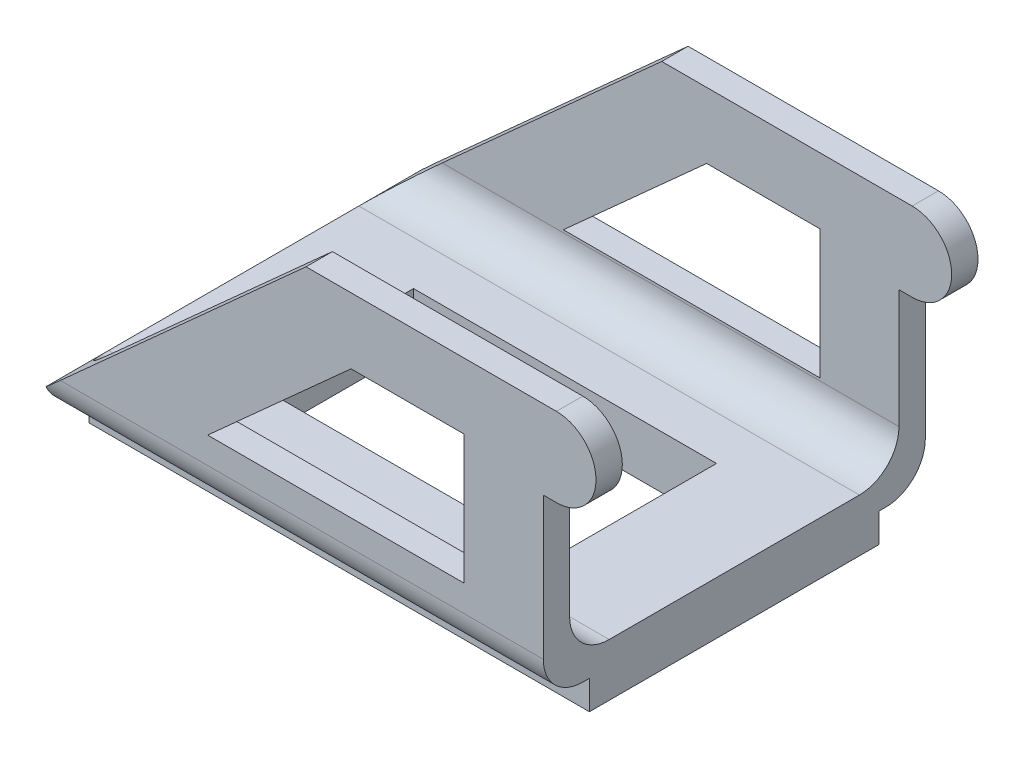
ISO-10303-21;
HEADER;
FILE_DESCRIPTION(('STEP AP214'),'2;1');
FILE_NAME('part.step','',(''),(''),'','','');
FILE_SCHEMA(('AUTOMOTIVE_DESIGN { 1 0 10303 214 1 1 1 1 }'));
ENDSEC;
DATA;
#1=APPLICATION_CONTEXT('core data for automotive mechanical design processes');
#2=APPLICATION_PROTOCOL_DEFINITION('international standard','automotive_design',2000,#1);
#3=PRODUCT_CONTEXT('',#1,'mechanical');
#4=PRODUCT('Part','Part','',(#3));
#5=PRODUCT_RELATED_PRODUCT_CATEGORY('part','',(#4));
#6=PRODUCT_DEFINITION_FORMATION('','',#4);
#7=PRODUCT_DEFINITION_CONTEXT('part definition',#1,'design');
#8=PRODUCT_DEFINITION('design','',#6,#7);
#9=PRODUCT_DEFINITION_SHAPE('','',#8);
#10=(LENGTH_UNIT() NAMED_UNIT(*) SI_UNIT(.MILLI.,.METRE.));
#11=(NAMED_UNIT(*) PLANE_ANGLE_UNIT() SI_UNIT($,.RADIAN.));
#12=(NAMED_UNIT(*) SI_UNIT($,.STERADIAN.) SOLID_ANGLE_UNIT());
#13=UNCERTAINTY_MEASURE_WITH_UNIT(LENGTH_MEASURE(1.E-05),#10,'distance_accuracy_value','');
#14=(GEOMETRIC_REPRESENTATION_CONTEXT(3) GLOBAL_UNCERTAINTY_ASSIGNED_CONTEXT((#13)) GLOBAL_UNIT_ASSIGNED_CONTEXT((#10,
#11,#12)) REPRESENTATION_CONTEXT('',''));
#15=CARTESIAN_POINT('',(0.,0.,0.));
#16=DIRECTION('',(0.,0.,1.));
#17=DIRECTION('',(1.,0.,0.));
#18=AXIS2_PLACEMENT_3D('',#15,#16,#17);
#19=CARTESIAN_POINT('',(23.,2.2,-14.5));
#20=DIRECTION('',(0.,0.,-1.));
#21=DIRECTION('',(-1.,0.,0.));
#22=AXIS2_PLACEMENT_3D('',#19,#20,#21);
#23=PLANE('',#22);
#24=CARTESIAN_POINT('',(20.,19.,-14.5));
#25=DIRECTION('',(0.,0.,-1.));
#26=DIRECTION('',(-1.,0.,0.));
#27=AXIS2_PLACEMENT_3D('',#24,#25,#26);
#28=CIRCLE('',#27,1.);
#29=CARTESIAN_POINT('',(19.,19.,-14.5));
#30=VERTEX_POINT('',#29);
#31=EDGE_CURVE('E323',#30,#30,#28,.T.);
#32=ORIENTED_EDGE('',*,*,#31,.F.);
#33=EDGE_LOOP('',(#32));
#34=FACE_BOUND('',#33,.T.);
#35=DIRECTION('',(0.743144825477394,0.669130606358859,0.));
#36=VECTOR('',#35,1.);
#37=CARTESIAN_POINT('',(4.4048219919671,17.,-14.5));
#38=LINE('',#37,#36);
#39=CARTESIAN_POINT('',(-6.47918065335896,7.2,-14.5));
#40=VERTEX_POINT('',#39);
#41=CARTESIAN_POINT('',(4.4048219919671,17.,-14.5));
#42=VERTEX_POINT('',#41);
#43=EDGE_CURVE('E85',#40,#42,#38,.T.);
#44=ORIENTED_EDGE('',*,*,#43,.F.);
#45=DIRECTION('',(-1.,0.,0.));
#46=VECTOR('',#45,1.);
#47=CARTESIAN_POINT('',(-6.47918065335896,7.2,-14.5));
#48=LINE('',#47,#46);
#49=CARTESIAN_POINT('',(13.,7.2,-14.5));
#50=VERTEX_POINT('',#49);
#51=EDGE_CURVE('E316',#50,#40,#48,.T.);
#52=ORIENTED_EDGE('',*,*,#51,.F.);
#53=DIRECTION('',(0.,-1.,0.));
#54=VECTOR('',#53,1.);
#55=CARTESIAN_POINT('',(13.,7.2,-14.5));
#56=LINE('',#55,#54);
#57=CARTESIAN_POINT('',(13.,17.,-14.5));
#58=VERTEX_POINT('',#57);
#59=EDGE_CURVE('E320',#58,#50,#56,.T.);
#60=ORIENTED_EDGE('',*,*,#59,.F.);
#61=DIRECTION('',(1.,0.,0.));
#62=VECTOR('',#61,1.);
#63=CARTESIAN_POINT('',(13.,17.,-14.5));
#64=LINE('',#63,#62);
#65=EDGE_CURVE('E331',#42,#58,#64,.T.);
#66=ORIENTED_EDGE('',*,*,#65,.F.);
#67=EDGE_LOOP('',(#44,#52,#60,#66));
#68=FACE_BOUND('',#67,.T.);
#69=DIRECTION('',(-1.,0.,0.));
#70=VECTOR('',#69,1.);
#71=CARTESIAN_POINT('',(23.,22.,-14.5));
#72=LINE('',#71,#70);
#73=CARTESIAN_POINT('',(20.,22.,-14.5));
#74=VERTEX_POINT('',#73);
#75=CARTESIAN_POINT('',(0.991025266925419,22.,-14.5));
#76=VERTEX_POINT('',#75);
#77=EDGE_CURVE('E506',#74,#76,#72,.T.);
#78=ORIENTED_EDGE('',*,*,#77,.F.);
#79=CARTESIAN_POINT('',(20.,19.,-14.5));
#80=DIRECTION('',(0.,0.,-1.));
#81=DIRECTION('',(-1.,0.,0.));
#82=AXIS2_PLACEMENT_3D('',#79,#80,#81);
#83=CIRCLE('',#82,3.);
#84=CARTESIAN_POINT('',(20.,16.,-14.5));
#85=VERTEX_POINT('',#84);
#86=EDGE_CURVE('E420',#74,#85,#83,.T.);
#87=ORIENTED_EDGE('',*,*,#86,.T.);
#88=DIRECTION('',(-1.,0.,0.));
#89=VECTOR('',#88,1.);
#90=CARTESIAN_POINT('',(0.,16.,-14.5));
#91=LINE('',#90,#89);
#92=CARTESIAN_POINT('',(19.,16.,-14.5));
#93=VERTEX_POINT('',#92);
#94=EDGE_CURVE('E430',#85,#93,#91,.T.);
#95=ORIENTED_EDGE('',*,*,#94,.T.);
#96=DIRECTION('',(0.,-1.,0.));
#97=VECTOR('',#96,1.);
#98=CARTESIAN_POINT('',(19.,0.,-14.5));
#99=LINE('',#98,#97);
#100=CARTESIAN_POINT('',(19.,5.2,-14.5));
#101=VERTEX_POINT('',#100);
#102=EDGE_CURVE('E414',#93,#101,#99,.T.);
#103=ORIENTED_EDGE('',*,*,#102,.T.);
#104=DIRECTION('',(-1.,0.,0.));
#105=VECTOR('',#104,1.);
#106=CARTESIAN_POINT('',(23.,5.2,-14.5));
#107=LINE('',#106,#105);
#108=CARTESIAN_POINT('',(-17.667264982205,5.2,-14.5));
#109=VERTEX_POINT('',#108);
#110=EDGE_CURVE('E617',#101,#109,#107,.T.);
#111=ORIENTED_EDGE('',*,*,#110,.T.);
#112=DIRECTION('',(0.743144825477393,0.669130606358859,0.));
#113=VECTOR('',#112,1.);
#114=CARTESIAN_POINT('',(-10.4960233896939,11.6570149325339,-14.5));
#115=LINE('',#114,#113);
#116=EDGE_CURVE('E371',#109,#76,#115,.T.);
#117=ORIENTED_EDGE('',*,*,#116,.T.);
#118=EDGE_LOOP('',(#78,#87,#95,#103,#111,#117));
#119=FACE_BOUND('',#118,.T.);
#120=ADVANCED_FACE('F69',(#34,#68,#119),#23,.T.);
#121=CARTESIAN_POINT('',(23.,22.,-12.5));
#122=DIRECTION('',(0.,0.,1.));
#123=DIRECTION('',(0.,-1.,0.));
#124=AXIS2_PLACEMENT_3D('',#121,#122,#123);
#125=PLANE('',#124);
#126=DIRECTION('',(-0.743144825477393,-0.669130606358859,0.));
#127=VECTOR('',#126,1.);
#128=CARTESIAN_POINT('',(17.1605784250883,28.4853346804605,-12.5));
#129=LINE('',#128,#127);
#130=CARTESIAN_POINT('',(4.4048219919671,17.,-12.5));
#131=VERTEX_POINT('',#130);
#132=CARTESIAN_POINT('',(-6.47918065335896,7.2,-12.5));
#133=VERTEX_POINT('',#132);
#134=EDGE_CURVE('E368',#131,#133,#129,.T.);
#135=ORIENTED_EDGE('',*,*,#134,.F.);
#136=DIRECTION('',(-1.,0.,0.));
#137=VECTOR('',#136,1.);
#138=CARTESIAN_POINT('',(23.,17.,-12.5));
#139=LINE('',#138,#137);
#140=CARTESIAN_POINT('',(13.,17.,-12.5));
#141=VERTEX_POINT('',#140);
#142=EDGE_CURVE('E351',#141,#131,#139,.T.);
#143=ORIENTED_EDGE('',*,*,#142,.F.);
#144=DIRECTION('',(0.,1.,0.));
#145=VECTOR('',#144,1.);
#146=CARTESIAN_POINT('',(13.,22.,-12.5));
#147=LINE('',#146,#145);
#148=CARTESIAN_POINT('',(13.,7.2,-12.5));
#149=VERTEX_POINT('',#148);
#150=EDGE_CURVE('E357',#149,#141,#147,.T.);
#151=ORIENTED_EDGE('',*,*,#150,.F.);
#152=DIRECTION('',(1.,0.,0.));
#153=VECTOR('',#152,1.);
#154=CARTESIAN_POINT('',(23.,7.2,-12.5));
#155=LINE('',#154,#153);
#156=EDGE_CURVE('E363',#133,#149,#155,.T.);
#157=ORIENTED_EDGE('',*,*,#156,.F.);
#158=EDGE_LOOP('',(#135,#143,#151,#157));
#159=FACE_BOUND('',#158,.T.);
#160=CARTESIAN_POINT('',(20.,19.,-12.5));
#161=DIRECTION('',(0.,0.,1.));
#162=DIRECTION('',(0.,-1.,0.));
#163=AXIS2_PLACEMENT_3D('',#160,#161,#162);
#164=CIRCLE('',#163,3.);
#165=CARTESIAN_POINT('',(20.,16.,-12.5));
#166=VERTEX_POINT('',#165);
#167=CARTESIAN_POINT('',(20.,22.,-12.5));
#168=VERTEX_POINT('',#167);
#169=EDGE_CURVE('E469',#166,#168,#164,.T.);
#170=ORIENTED_EDGE('',*,*,#169,.T.);
#171=DIRECTION('',(-1.,0.,0.));
#172=VECTOR('',#171,1.);
#173=CARTESIAN_POINT('',(23.,22.,-12.5));
#174=LINE('',#173,#172);
#175=CARTESIAN_POINT('',(0.991025266925429,22.,-12.5));
#176=VERTEX_POINT('',#175);
#177=EDGE_CURVE('E501',#168,#176,#174,.T.);
#178=ORIENTED_EDGE('',*,*,#177,.T.);
#179=DIRECTION('',(-0.743144825477393,-0.669130606358859,0.));
#180=VECTOR('',#179,1.);
#181=CARTESIAN_POINT('',(13.1457947869351,32.9442036333249,-12.5));
#182=LINE('',#181,#180);
#183=CARTESIAN_POINT('',(-15.6681624555124,7.,-12.5));
#184=VERTEX_POINT('',#183);
#185=EDGE_CURVE('E403',#176,#184,#182,.T.);
#186=ORIENTED_EDGE('',*,*,#185,.T.);
#187=DIRECTION('',(-1.,0.,0.));
#188=VECTOR('',#187,1.);
#189=CARTESIAN_POINT('',(23.,7.,-12.5));
#190=LINE('',#189,#188);
#191=CARTESIAN_POINT('',(19.,7.,-12.5));
#192=VERTEX_POINT('',#191);
#193=EDGE_CURVE('E601',#184,#192,#190,.F.);
#194=ORIENTED_EDGE('',*,*,#193,.T.);
#195=DIRECTION('',(0.,1.,0.));
#196=VECTOR('',#195,1.);
#197=CARTESIAN_POINT('',(19.,22.,-12.5));
#198=LINE('',#197,#196);
#199=CARTESIAN_POINT('',(19.,16.,-12.5));
#200=VERTEX_POINT('',#199);
#201=EDGE_CURVE('E457',#192,#200,#198,.T.);
#202=ORIENTED_EDGE('',*,*,#201,.T.);
#203=DIRECTION('',(1.,0.,0.));
#204=VECTOR('',#203,1.);
#205=CARTESIAN_POINT('',(23.,16.,-12.5));
#206=LINE('',#205,#204);
#207=EDGE_CURVE('E476',#200,#166,#206,.T.);
#208=ORIENTED_EDGE('',*,*,#207,.T.);
#209=EDGE_LOOP('',(#170,#178,#186,#194,#202,#208));
#210=FACE_BOUND('',#209,.T.);
#211=ADVANCED_FACE('F649',(#159,#210),#125,.T.);
#212=CARTESIAN_POINT('',(23.,22.,12.5));
#213=DIRECTION('',(0.,0.,-1.));
#214=DIRECTION('',(0.,1.,0.));
#215=AXIS2_PLACEMENT_3D('',#212,#213,#214);
#216=PLANE('',#215);
#217=DIRECTION('',(0.743144825477393,0.669130606358859,0.));
#218=VECTOR('',#217,1.);
#219=CARTESIAN_POINT('',(17.1605784250883,28.4853346804605,12.5));
#220=LINE('',#219,#218);
#221=CARTESIAN_POINT('',(-6.47918065335896,7.2,12.5));
#222=VERTEX_POINT('',#221);
#223=CARTESIAN_POINT('',(4.4048219919671,17.,12.5));
#224=VERTEX_POINT('',#223);
#225=EDGE_CURVE('E294',#222,#224,#220,.T.);
#226=ORIENTED_EDGE('',*,*,#225,.F.);
#227=DIRECTION('',(-1.,0.,0.));
#228=VECTOR('',#227,1.);
#229=CARTESIAN_POINT('',(23.,7.2,12.5));
#230=LINE('',#229,#228);
#231=CARTESIAN_POINT('',(13.,7.2,12.5));
#232=VERTEX_POINT('',#231);
#233=EDGE_CURVE('E360',#232,#222,#230,.T.);
#234=ORIENTED_EDGE('',*,*,#233,.F.);
#235=DIRECTION('',(0.,-1.,0.));
#236=VECTOR('',#235,1.);
#237=CARTESIAN_POINT('',(13.,22.,12.5));
#238=LINE('',#237,#236);
#239=CARTESIAN_POINT('',(13.,17.,12.5));
#240=VERTEX_POINT('',#239);
#241=EDGE_CURVE('E354',#240,#232,#238,.T.);
#242=ORIENTED_EDGE('',*,*,#241,.F.);
#243=DIRECTION('',(1.,0.,0.));
#244=VECTOR('',#243,1.);
#245=CARTESIAN_POINT('',(23.,17.,12.5));
#246=LINE('',#245,#244);
#247=EDGE_CURVE('E340',#224,#240,#246,.T.);
#248=ORIENTED_EDGE('',*,*,#247,.F.);
#249=EDGE_LOOP('',(#226,#234,#242,#248));
#250=FACE_BOUND('',#249,.T.);
#251=DIRECTION('',(-1.,0.,0.));
#252=VECTOR('',#251,1.);
#253=CARTESIAN_POINT('',(23.,22.,12.5));
#254=LINE('',#253,#252);
#255=CARTESIAN_POINT('',(20.,22.,12.5));
#256=VERTEX_POINT('',#255);
#257=CARTESIAN_POINT('',(0.991025266925419,22.,12.5));
#258=VERTEX_POINT('',#257);
#259=EDGE_CURVE('E480',#256,#258,#254,.T.);
#260=ORIENTED_EDGE('',*,*,#259,.F.);
#261=CARTESIAN_POINT('',(20.,19.,12.5));
#262=DIRECTION('',(0.,0.,-1.));
#263=DIRECTION('',(0.,1.,0.));
#264=AXIS2_PLACEMENT_3D('',#261,#262,#263);
#265=CIRCLE('',#264,3.);
#266=CARTESIAN_POINT('',(20.,16.,12.5));
#267=VERTEX_POINT('',#266);
#268=EDGE_CURVE('E465',#256,#267,#265,.T.);
#269=ORIENTED_EDGE('',*,*,#268,.T.);
#270=DIRECTION('',(-1.,0.,0.));
#271=VECTOR('',#270,1.);
#272=CARTESIAN_POINT('',(23.,16.,12.5));
#273=LINE('',#272,#271);
#274=CARTESIAN_POINT('',(19.,16.,12.5));
#275=VERTEX_POINT('',#274);
#276=EDGE_CURVE('E472',#267,#275,#273,.T.);
#277=ORIENTED_EDGE('',*,*,#276,.T.);
#278=DIRECTION('',(0.,-1.,0.));
#279=VECTOR('',#278,1.);
#280=CARTESIAN_POINT('',(19.,22.,12.5));
#281=LINE('',#280,#279);
#282=CARTESIAN_POINT('',(19.,7.,12.5));
#283=VERTEX_POINT('',#282);
#284=EDGE_CURVE('E461',#275,#283,#281,.T.);
#285=ORIENTED_EDGE('',*,*,#284,.T.);
#286=DIRECTION('',(-1.,0.,0.));
#287=VECTOR('',#286,1.);
#288=CARTESIAN_POINT('',(23.,7.,12.5));
#289=LINE('',#288,#287);
#290=CARTESIAN_POINT('',(-15.6681624555124,7.,12.5));
#291=VERTEX_POINT('',#290);
#292=EDGE_CURVE('E485',#283,#291,#289,.T.);
#293=ORIENTED_EDGE('',*,*,#292,.T.);
#294=DIRECTION('',(0.743144825477393,0.669130606358859,0.));
#295=VECTOR('',#294,1.);
#296=CARTESIAN_POINT('',(13.1457947869351,32.9442036333249,12.5));
#297=LINE('',#296,#295);
#298=EDGE_CURVE('E410',#291,#258,#297,.T.);
#299=ORIENTED_EDGE('',*,*,#298,.T.);
#300=EDGE_LOOP('',(#260,#269,#277,#285,#293,#299));
#301=FACE_BOUND('',#300,.T.);
#302=ADVANCED_FACE('F657',(#250,#301),#216,.T.);
#303=CARTESIAN_POINT('',(23.,2.2,14.5));
#304=DIRECTION('',(0.,0.,1.));
#305=DIRECTION('',(1.,0.,0.));
#306=AXIS2_PLACEMENT_3D('',#303,#304,#305);
#307=PLANE('',#306);
#308=DIRECTION('',(0.743144825477394,0.669130606358859,0.));
#309=VECTOR('',#308,1.);
#310=CARTESIAN_POINT('',(4.4048219919671,17.,14.5));
#311=LINE('',#310,#309);
#312=CARTESIAN_POINT('',(-6.47918065335896,7.2,14.5));
#313=VERTEX_POINT('',#312);
#314=CARTESIAN_POINT('',(4.4048219919671,17.,14.5));
#315=VERTEX_POINT('',#314);
#316=EDGE_CURVE('E291',#313,#315,#311,.T.);
#317=ORIENTED_EDGE('',*,*,#316,.T.);
#318=DIRECTION('',(1.,0.,0.));
#319=VECTOR('',#318,1.);
#320=CARTESIAN_POINT('',(13.,17.,14.5));
#321=LINE('',#320,#319);
#322=CARTESIAN_POINT('',(13.,17.,14.5));
#323=VERTEX_POINT('',#322);
#324=EDGE_CURVE('E302',#315,#323,#321,.T.);
#325=ORIENTED_EDGE('',*,*,#324,.T.);
#326=DIRECTION('',(0.,-1.,0.));
#327=VECTOR('',#326,1.);
#328=CARTESIAN_POINT('',(13.,7.2,14.5));
#329=LINE('',#328,#327);
#330=CARTESIAN_POINT('',(13.,7.2,14.5));
#331=VERTEX_POINT('',#330);
#332=EDGE_CURVE('E309',#323,#331,#329,.T.);
#333=ORIENTED_EDGE('',*,*,#332,.T.);
#334=DIRECTION('',(-1.,0.,0.));
#335=VECTOR('',#334,1.);
#336=CARTESIAN_POINT('',(-6.47918065335896,7.2,14.5));
#337=LINE('',#336,#335);
#338=EDGE_CURVE('E314',#331,#313,#337,.T.);
#339=ORIENTED_EDGE('',*,*,#338,.T.);
#340=EDGE_LOOP('',(#317,#325,#333,#339));
#341=FACE_BOUND('',#340,.T.);
#342=CARTESIAN_POINT('',(20.,19.,14.5));
#343=DIRECTION('',(0.,0.,-1.));
#344=DIRECTION('',(-1.,0.,0.));
#345=AXIS2_PLACEMENT_3D('',#342,#343,#344);
#346=CIRCLE('',#345,3.);
#347=CARTESIAN_POINT('',(20.,22.,14.5));
#348=VERTEX_POINT('',#347);
#349=CARTESIAN_POINT('',(20.,16.,14.5));
#350=VERTEX_POINT('',#349);
#351=EDGE_CURVE('E423',#348,#350,#346,.T.);
#352=ORIENTED_EDGE('',*,*,#351,.F.);
#353=DIRECTION('',(-1.,0.,0.));
#354=VECTOR('',#353,1.);
#355=CARTESIAN_POINT('',(23.,22.,14.5));
#356=LINE('',#355,#354);
#357=CARTESIAN_POINT('',(0.991025266925426,22.,14.5));
#358=VERTEX_POINT('',#357);
#359=EDGE_CURVE('E487',#348,#358,#356,.T.);
#360=ORIENTED_EDGE('',*,*,#359,.T.);
#361=DIRECTION('',(0.743144825477393,0.669130606358859,0.));
#362=VECTOR('',#361,1.);
#363=CARTESIAN_POINT('',(-10.4960233896939,11.6570149325339,14.5));
#364=LINE('',#363,#362);
#365=CARTESIAN_POINT('',(-17.667264982205,5.2,14.5));
#366=VERTEX_POINT('',#365);
#367=EDGE_CURVE('E378',#366,#358,#364,.T.);
#368=ORIENTED_EDGE('',*,*,#367,.F.);
#369=DIRECTION('',(-1.,0.,0.));
#370=VECTOR('',#369,1.);
#371=CARTESIAN_POINT('',(23.,5.2,14.5));
#372=LINE('',#371,#370);
#373=CARTESIAN_POINT('',(19.,5.2,14.5));
#374=VERTEX_POINT('',#373);
#375=EDGE_CURVE('E614',#366,#374,#372,.F.);
#376=ORIENTED_EDGE('',*,*,#375,.T.);
#377=DIRECTION('',(0.,-1.,0.));
#378=VECTOR('',#377,1.);
#379=CARTESIAN_POINT('',(19.,0.,14.5));
#380=LINE('',#379,#378);
#381=CARTESIAN_POINT('',(19.,16.,14.5));
#382=VERTEX_POINT('',#381);
#383=EDGE_CURVE('E415',#382,#374,#380,.T.);
#384=ORIENTED_EDGE('',*,*,#383,.F.);
#385=DIRECTION('',(-1.,0.,0.));
#386=VECTOR('',#385,1.);
#387=CARTESIAN_POINT('',(0.,16.,14.5));
#388=LINE('',#387,#386);
#389=EDGE_CURVE('E419',#350,#382,#388,.T.);
#390=ORIENTED_EDGE('',*,*,#389,.F.);
#391=EDGE_LOOP('',(#352,#360,#368,#376,#384,#390));
#392=FACE_BOUND('',#391,.T.);
#393=ADVANCED_FACE('F311',(#341,#392),#307,.T.);
#394=CARTESIAN_POINT('',(23.,7.,9.5));
#395=DIRECTION('',(-1.,0.,0.));
#396=DIRECTION('',(0.,0.,1.));
#397=AXIS2_PLACEMENT_3D('',#394,#395,#396);
#398=CYLINDRICAL_SURFACE('',#397,3.);
#399=CARTESIAN_POINT('',(-15.6681624555124,7.,9.5));
#400=DIRECTION('',(-0.669130606358859,0.743144825477393,0.));
#401=DIRECTION('',(-0.743144825477393,-0.669130606358859,0.));
#402=AXIS2_PLACEMENT_3D('',#399,#400,#401);
#403=ELLIPSE('',#402,4.48342964959382,3.);
#404=CARTESIAN_POINT('',(-19.,4.,9.5));
#405=VERTEX_POINT('',#404);
#406=EDGE_CURVE('E407',#291,#405,#403,.F.);
#407=ORIENTED_EDGE('',*,*,#406,.F.);
#408=ORIENTED_EDGE('',*,*,#292,.F.);
#409=CARTESIAN_POINT('',(19.,7.,9.5));
#410=DIRECTION('',(-1.,0.,0.));
#411=DIRECTION('',(0.,0.,1.));
#412=AXIS2_PLACEMENT_3D('',#409,#410,#411);
#413=CIRCLE('',#412,3.);
#414=CARTESIAN_POINT('',(19.,4.,9.5));
#415=VERTEX_POINT('',#414);
#416=EDGE_CURVE('E625',#415,#283,#413,.T.);
#417=ORIENTED_EDGE('',*,*,#416,.F.);
#418=DIRECTION('',(-1.,0.,0.));
#419=VECTOR('',#418,1.);
#420=CARTESIAN_POINT('',(0.,4.,9.5));
#421=LINE('',#420,#419);
#422=EDGE_CURVE('E598',#405,#415,#421,.F.);
#423=ORIENTED_EDGE('',*,*,#422,.F.);
#424=EDGE_LOOP('',(#407,#408,#417,#423));
#425=FACE_BOUND('',#424,.T.);
#426=ADVANCED_FACE('F714',(#425),#398,.F.);
#427=CARTESIAN_POINT('',(0.,7.,-9.5));
#428=DIRECTION('',(-1.,0.,0.));
#429=DIRECTION('',(0.,0.,1.));
#430=AXIS2_PLACEMENT_3D('',#427,#428,#429);
#431=CYLINDRICAL_SURFACE('',#430,3.);
#432=CARTESIAN_POINT('',(-15.6681624555124,7.,-9.5));
#433=DIRECTION('',(-0.669130606358859,0.743144825477393,0.));
#434=DIRECTION('',(-0.743144825477393,-0.669130606358859,0.));
#435=AXIS2_PLACEMENT_3D('',#432,#433,#434);
#436=ELLIPSE('',#435,4.48342964959382,3.);
#437=CARTESIAN_POINT('',(-19.,4.,-9.5));
#438=VERTEX_POINT('',#437);
#439=EDGE_CURVE('E400',#438,#184,#436,.F.);
#440=ORIENTED_EDGE('',*,*,#439,.F.);
#441=DIRECTION('',(-1.,0.,0.));
#442=VECTOR('',#441,1.);
#443=CARTESIAN_POINT('',(0.,4.,-9.5));
#444=LINE('',#443,#442);
#445=CARTESIAN_POINT('',(19.,4.,-9.5));
#446=VERTEX_POINT('',#445);
#447=EDGE_CURVE('E594',#446,#438,#444,.T.);
#448=ORIENTED_EDGE('',*,*,#447,.F.);
#449=CARTESIAN_POINT('',(19.,7.,-9.5));
#450=DIRECTION('',(-1.,0.,0.));
#451=DIRECTION('',(0.,0.,1.));
#452=AXIS2_PLACEMENT_3D('',#449,#450,#451);
#453=CIRCLE('',#452,3.);
#454=EDGE_CURVE('E628',#192,#446,#453,.T.);
#455=ORIENTED_EDGE('',*,*,#454,.F.);
#456=ORIENTED_EDGE('',*,*,#193,.F.);
#457=EDGE_LOOP('',(#440,#448,#455,#456));
#458=FACE_BOUND('',#457,.T.);
#459=ADVANCED_FACE('F717',(#458),#431,.F.);
#460=CARTESIAN_POINT('',(23.,5.2,11.5));
#461=DIRECTION('',(-1.,0.,0.));
#462=DIRECTION('',(0.,0.,1.));
#463=AXIS2_PLACEMENT_3D('',#460,#461,#462);
#464=CYLINDRICAL_SURFACE('',#463,3.);
#465=ORIENTED_EDGE('',*,*,#375,.F.);
#466=CARTESIAN_POINT('',(-17.667264982205,5.2,11.5));
#467=DIRECTION('',(-0.669130606358859,0.743144825477393,0.));
#468=DIRECTION('',(-0.743144825477393,-0.669130606358859,0.));
#469=AXIS2_PLACEMENT_3D('',#466,#467,#468);
#470=ELLIPSE('',#469,4.48342964959382,3.);
#471=CARTESIAN_POINT('',(-19.,4.,14.2495454169735));
#472=VERTEX_POINT('',#471);
#473=EDGE_CURVE('E396',#366,#472,#470,.F.);
#474=ORIENTED_EDGE('',*,*,#473,.T.);
#475=CARTESIAN_POINT('',(-19.,5.2,11.5));
#476=DIRECTION('',(1.,0.,0.));
#477=DIRECTION('',(0.,0.,-1.));
#478=AXIS2_PLACEMENT_3D('',#475,#476,#477);
#479=CIRCLE('',#478,3.);
#480=CARTESIAN_POINT('',(-19.,2.2,11.5));
#481=VERTEX_POINT('',#480);
#482=EDGE_CURVE('E610',#481,#472,#479,.F.);
#483=ORIENTED_EDGE('',*,*,#482,.F.);
#484=DIRECTION('',(-1.,0.,0.));
#485=VECTOR('',#484,1.);
#486=CARTESIAN_POINT('',(23.,2.2,11.5));
#487=LINE('',#486,#485);
#488=CARTESIAN_POINT('',(19.,2.2,11.5));
#489=VERTEX_POINT('',#488);
#490=EDGE_CURVE('E604',#489,#481,#487,.T.);
#491=ORIENTED_EDGE('',*,*,#490,.F.);
#492=CARTESIAN_POINT('',(19.,5.2,11.5));
#493=DIRECTION('',(1.,0.,0.));
#494=DIRECTION('',(0.,0.,-1.));
#495=AXIS2_PLACEMENT_3D('',#492,#493,#494);
#496=CIRCLE('',#495,3.);
#497=EDGE_CURVE('E449',#489,#374,#496,.F.);
#498=ORIENTED_EDGE('',*,*,#497,.T.);
#499=EDGE_LOOP('',(#465,#474,#483,#491,#498));
#500=FACE_BOUND('',#499,.T.);
#501=ADVANCED_FACE('F721',(#500),#464,.T.);
#502=CARTESIAN_POINT('',(23.,5.2,-11.5));
#503=DIRECTION('',(-1.,0.,0.));
#504=DIRECTION('',(0.,0.,1.));
#505=AXIS2_PLACEMENT_3D('',#502,#503,#504);
#506=CYLINDRICAL_SURFACE('',#505,3.);
#507=CARTESIAN_POINT('',(-19.,5.2,-11.5));
#508=DIRECTION('',(1.,0.,0.));
#509=DIRECTION('',(0.,0.,-1.));
#510=AXIS2_PLACEMENT_3D('',#507,#508,#509);
#511=CIRCLE('',#510,3.);
#512=CARTESIAN_POINT('',(-19.,4.,-14.2495454169735));
#513=VERTEX_POINT('',#512);
#514=CARTESIAN_POINT('',(-19.,2.2,-11.5));
#515=VERTEX_POINT('',#514);
#516=EDGE_CURVE('E607',#513,#515,#511,.F.);
#517=ORIENTED_EDGE('',*,*,#516,.F.);
#518=CARTESIAN_POINT('',(-17.667264982205,5.2,-11.5));
#519=DIRECTION('',(-0.669130606358859,0.743144825477393,0.));
#520=DIRECTION('',(-0.743144825477393,-0.669130606358859,0.));
#521=AXIS2_PLACEMENT_3D('',#518,#519,#520);
#522=ELLIPSE('',#521,4.48342964959382,3.);
#523=EDGE_CURVE('E376',#513,#109,#522,.F.);
#524=ORIENTED_EDGE('',*,*,#523,.T.);
#525=ORIENTED_EDGE('',*,*,#110,.F.);
#526=CARTESIAN_POINT('',(19.,5.2,-11.5));
#527=DIRECTION('',(1.,0.,0.));
#528=DIRECTION('',(0.,0.,-1.));
#529=AXIS2_PLACEMENT_3D('',#526,#527,#528);
#530=CIRCLE('',#529,3.);
#531=CARTESIAN_POINT('',(19.,2.2,-11.5));
#532=VERTEX_POINT('',#531);
#533=EDGE_CURVE('E631',#101,#532,#530,.F.);
#534=ORIENTED_EDGE('',*,*,#533,.T.);
#535=DIRECTION('',(-1.,0.,0.));
#536=VECTOR('',#535,1.);
#537=CARTESIAN_POINT('',(23.,2.2,-11.5));
#538=LINE('',#537,#536);
#539=EDGE_CURVE('E621',#515,#532,#538,.F.);
#540=ORIENTED_EDGE('',*,*,#539,.F.);
#541=EDGE_LOOP('',(#517,#524,#525,#534,#540));
#542=FACE_BOUND('',#541,.T.);
#543=ADVANCED_FACE('F705',(#542),#506,.T.);
#544=CARTESIAN_POINT('',(-19.,4.,11.));
#545=DIRECTION('',(1.,0.,0.));
#546=DIRECTION('',(0.,0.,-1.));
#547=AXIS2_PLACEMENT_3D('',#544,#545,#546);
#548=PLANE('',#547);
#549=DIRECTION('',(0.,0.,-1.));
#550=VECTOR('',#549,1.);
#551=CARTESIAN_POINT('',(-19.,4.,14.5));
#552=LINE('',#551,#550);
#553=EDGE_CURVE('E381',#438,#513,#552,.T.);
#554=ORIENTED_EDGE('',*,*,#553,.T.);
#555=ORIENTED_EDGE('',*,*,#516,.T.);
#556=DIRECTION('',(0.,0.,1.));
#557=VECTOR('',#556,1.);
#558=CARTESIAN_POINT('',(-19.,2.2,-11.));
#559=LINE('',#558,#557);
#560=CARTESIAN_POINT('',(-19.,2.2,-11.));
#561=VERTEX_POINT('',#560);
#562=EDGE_CURVE('E498',#515,#561,#559,.T.);
#563=ORIENTED_EDGE('',*,*,#562,.T.);
#564=DIRECTION('',(0.,-1.,0.));
#565=VECTOR('',#564,1.);
#566=CARTESIAN_POINT('',(-19.,4.,-11.));
#567=LINE('',#566,#565);
#568=CARTESIAN_POINT('',(-19.,0.,-11.));
#569=VERTEX_POINT('',#568);
#570=EDGE_CURVE('E586',#561,#569,#567,.T.);
#571=ORIENTED_EDGE('',*,*,#570,.T.);
#572=DIRECTION('',(0.,0.,1.));
#573=VECTOR('',#572,1.);
#574=CARTESIAN_POINT('',(-19.,0.,11.));
#575=LINE('',#574,#573);
#576=CARTESIAN_POINT('',(-19.,0.,11.));
#577=VERTEX_POINT('',#576);
#578=EDGE_CURVE('E574',#569,#577,#575,.T.);
#579=ORIENTED_EDGE('',*,*,#578,.T.);
#580=DIRECTION('',(0.,-1.,0.));
#581=VECTOR('',#580,1.);
#582=CARTESIAN_POINT('',(-19.,4.,11.));
#583=LINE('',#582,#581);
#584=CARTESIAN_POINT('',(-19.,2.2,11.));
#585=VERTEX_POINT('',#584);
#586=EDGE_CURVE('E583',#585,#577,#583,.T.);
#587=ORIENTED_EDGE('',*,*,#586,.F.);
#588=DIRECTION('',(0.,0.,1.));
#589=VECTOR('',#588,1.);
#590=CARTESIAN_POINT('',(-19.,2.2,11.));
#591=LINE('',#590,#589);
#592=EDGE_CURVE('E491',#585,#481,#591,.T.);
#593=ORIENTED_EDGE('',*,*,#592,.T.);
#594=ORIENTED_EDGE('',*,*,#482,.T.);
#595=EDGE_CURVE('E392',#472,#405,#552,.T.);
#596=ORIENTED_EDGE('',*,*,#595,.T.);
#597=DIRECTION('',(0.,0.,1.));
#598=VECTOR('',#597,1.);
#599=CARTESIAN_POINT('',(-19.,4.,11.));
#600=LINE('',#599,#598);
#601=EDGE_CURVE('E561',#438,#405,#600,.T.);
#602=ORIENTED_EDGE('',*,*,#601,.F.);
#603=EDGE_LOOP('',(#554,#555,#563,#571,#579,#587,#593,#594,#596,#602));
#604=FACE_BOUND('',#603,.T.);
#605=ADVANCED_FACE('F669',(#604),#548,.F.);
#606=CARTESIAN_POINT('',(23.,22.,-14.5));
#607=DIRECTION('',(0.,1.,0.));
#608=DIRECTION('',(0.,0.,1.));
#609=AXIS2_PLACEMENT_3D('',#606,#607,#608);
#610=PLANE('',#609);
#611=ORIENTED_EDGE('',*,*,#177,.F.);
#612=DIRECTION('',(0.,0.,-1.));
#613=VECTOR('',#612,1.);
#614=CARTESIAN_POINT('',(20.,22.,14.5));
#615=LINE('',#614,#613);
#616=EDGE_CURVE('E377',#168,#74,#615,.T.);
#617=ORIENTED_EDGE('',*,*,#616,.T.);
#618=ORIENTED_EDGE('',*,*,#77,.T.);
#619=DIRECTION('',(0.,0.,-1.));
#620=VECTOR('',#619,1.);
#621=CARTESIAN_POINT('',(0.991025266925419,22.,14.5));
#622=LINE('',#621,#620);
#623=EDGE_CURVE('E388',#176,#76,#622,.T.);
#624=ORIENTED_EDGE('',*,*,#623,.F.);
#625=EDGE_LOOP('',(#611,#617,#618,#624));
#626=FACE_BOUND('',#625,.T.);
#627=ADVANCED_FACE('F666',(#626),#610,.T.);
#628=CARTESIAN_POINT('',(23.,22.,14.5));
#629=DIRECTION('',(0.,1.,0.));
#630=DIRECTION('',(0.,0.,1.));
#631=AXIS2_PLACEMENT_3D('',#628,#629,#630);
#632=PLANE('',#631);
#633=ORIENTED_EDGE('',*,*,#359,.F.);
#634=EDGE_CURVE('E372',#348,#256,#615,.T.);
#635=ORIENTED_EDGE('',*,*,#634,.T.);
#636=ORIENTED_EDGE('',*,*,#259,.T.);
#637=EDGE_CURVE('E385',#358,#258,#622,.T.);
#638=ORIENTED_EDGE('',*,*,#637,.F.);
#639=EDGE_LOOP('',(#633,#635,#636,#638));
#640=FACE_BOUND('',#639,.T.);
#641=ADVANCED_FACE('F668',(#640),#632,.T.);
#642=CARTESIAN_POINT('',(23.,2.2,-11.));
#643=DIRECTION('',(0.,-1.,0.));
#644=DIRECTION('',(0.,0.,-1.));
#645=AXIS2_PLACEMENT_3D('',#642,#643,#644);
#646=PLANE('',#645);
#647=ORIENTED_EDGE('',*,*,#539,.T.);
#648=DIRECTION('',(0.,0.,1.));
#649=VECTOR('',#648,1.);
#650=CARTESIAN_POINT('',(19.,2.2,-11.));
#651=LINE('',#650,#649);
#652=CARTESIAN_POINT('',(19.,2.2,-11.));
#653=VERTEX_POINT('',#652);
#654=EDGE_CURVE('E441',#532,#653,#651,.T.);
#655=ORIENTED_EDGE('',*,*,#654,.T.);
#656=DIRECTION('',(-1.,0.,0.));
#657=VECTOR('',#656,1.);
#658=CARTESIAN_POINT('',(23.,2.2,-11.));
#659=LINE('',#658,#657);
#660=EDGE_CURVE('E486',#653,#561,#659,.T.);
#661=ORIENTED_EDGE('',*,*,#660,.T.);
#662=ORIENTED_EDGE('',*,*,#562,.F.);
#663=EDGE_LOOP('',(#647,#655,#661,#662));
#664=FACE_BOUND('',#663,.T.);
#665=ADVANCED_FACE('F664',(#664),#646,.T.);
#666=CARTESIAN_POINT('',(23.,2.2,11.));
#667=DIRECTION('',(0.,-1.,0.));
#668=DIRECTION('',(0.,0.,-1.));
#669=AXIS2_PLACEMENT_3D('',#666,#667,#668);
#670=PLANE('',#669);
#671=DIRECTION('',(-1.,0.,0.));
#672=VECTOR('',#671,1.);
#673=CARTESIAN_POINT('',(23.,2.2,11.));
#674=LINE('',#673,#672);
#675=CARTESIAN_POINT('',(19.,2.2,11.));
#676=VERTEX_POINT('',#675);
#677=EDGE_CURVE('E481',#676,#585,#674,.T.);
#678=ORIENTED_EDGE('',*,*,#677,.F.);
#679=DIRECTION('',(0.,0.,1.));
#680=VECTOR('',#679,1.);
#681=CARTESIAN_POINT('',(19.,2.2,11.));
#682=LINE('',#681,#680);
#683=EDGE_CURVE('E453',#676,#489,#682,.T.);
#684=ORIENTED_EDGE('',*,*,#683,.T.);
#685=ORIENTED_EDGE('',*,*,#490,.T.);
#686=ORIENTED_EDGE('',*,*,#592,.F.);
#687=EDGE_LOOP('',(#678,#684,#685,#686));
#688=FACE_BOUND('',#687,.T.);
#689=ADVANCED_FACE('F709',(#688),#670,.T.);
#690=CARTESIAN_POINT('',(-19.,4.,-11.));
#691=DIRECTION('',(0.,0.,1.));
#692=DIRECTION('',(1.,0.,0.));
#693=AXIS2_PLACEMENT_3D('',#690,#691,#692);
#694=PLANE('',#693);
#695=ORIENTED_EDGE('',*,*,#660,.F.);
#696=DIRECTION('',(0.,-1.,0.));
#697=VECTOR('',#696,1.);
#698=CARTESIAN_POINT('',(19.,4.,-11.));
#699=LINE('',#698,#697);
#700=CARTESIAN_POINT('',(19.,0.,-11.));
#701=VERTEX_POINT('',#700);
#702=EDGE_CURVE('E505',#653,#701,#699,.T.);
#703=ORIENTED_EDGE('',*,*,#702,.T.);
#704=DIRECTION('',(-1.,0.,0.));
#705=VECTOR('',#704,1.);
#706=CARTESIAN_POINT('',(-19.,0.,-11.));
#707=LINE('',#706,#705);
#708=EDGE_CURVE('E570',#701,#569,#707,.T.);
#709=ORIENTED_EDGE('',*,*,#708,.T.);
#710=ORIENTED_EDGE('',*,*,#570,.F.);
#711=EDGE_LOOP('',(#695,#703,#709,#710));
#712=FACE_BOUND('',#711,.T.);
#713=ADVANCED_FACE('F694',(#712),#694,.F.);
#714=CARTESIAN_POINT('',(0.,4.,0.));
#715=DIRECTION('',(0.,-1.,0.));
#716=DIRECTION('',(0.,0.,-1.));
#717=AXIS2_PLACEMENT_3D('',#714,#715,#716);
#718=PLANE('',#717);
#719=ORIENTED_EDGE('',*,*,#601,.T.);
#720=ORIENTED_EDGE('',*,*,#422,.T.);
#721=DIRECTION('',(0.,0.,-1.));
#722=VECTOR('',#721,1.);
#723=CARTESIAN_POINT('',(19.,4.,11.));
#724=LINE('',#723,#722);
#725=EDGE_CURVE('E557',#415,#446,#724,.T.);
#726=ORIENTED_EDGE('',*,*,#725,.T.);
#727=ORIENTED_EDGE('',*,*,#447,.T.);
#728=EDGE_LOOP('',(#719,#720,#726,#727));
#729=FACE_BOUND('',#728,.T.);
#730=DIRECTION('',(0.,0.,-1.));
#731=VECTOR('',#730,1.);
#732=CARTESIAN_POINT('',(11.5,4.,6.15));
#733=LINE('',#732,#731);
#734=CARTESIAN_POINT('',(11.5,4.,6.15));
#735=VERTEX_POINT('',#734);
#736=CARTESIAN_POINT('',(11.5,4.,-6.15));
#737=VERTEX_POINT('',#736);
#738=EDGE_CURVE('E514',#735,#737,#733,.T.);
#739=ORIENTED_EDGE('',*,*,#738,.F.);
#740=DIRECTION('',(1.,0.,0.));
#741=VECTOR('',#740,1.);
#742=CARTESIAN_POINT('',(-11.5,4.,6.15));
#743=LINE('',#742,#741);
#744=CARTESIAN_POINT('',(-11.5,4.,6.15));
#745=VERTEX_POINT('',#744);
#746=EDGE_CURVE('E525',#745,#735,#743,.T.);
#747=ORIENTED_EDGE('',*,*,#746,.F.);
#748=DIRECTION('',(0.,0.,1.));
#749=VECTOR('',#748,1.);
#750=CARTESIAN_POINT('',(-11.5,4.,6.15));
#751=LINE('',#750,#749);
#752=CARTESIAN_POINT('',(-11.5,4.,-6.15));
#753=VERTEX_POINT('',#752);
#754=EDGE_CURVE('E521',#753,#745,#751,.T.);
#755=ORIENTED_EDGE('',*,*,#754,.F.);
#756=DIRECTION('',(-1.,0.,0.));
#757=VECTOR('',#756,1.);
#758=CARTESIAN_POINT('',(-11.5,4.,-6.15));
#759=LINE('',#758,#757);
#760=EDGE_CURVE('E517',#737,#753,#759,.T.);
#761=ORIENTED_EDGE('',*,*,#760,.F.);
#762=EDGE_LOOP('',(#739,#747,#755,#761));
#763=FACE_BOUND('',#762,.T.);
#764=ADVANCED_FACE('F690',(#729,#763),#718,.F.);
#765=CARTESIAN_POINT('',(0.,0.,0.));
#766=DIRECTION('',(0.,-1.,0.));
#767=DIRECTION('',(0.,0.,-1.));
#768=AXIS2_PLACEMENT_3D('',#765,#766,#767);
#769=PLANE('',#768);
#770=DIRECTION('',(0.,0.,-1.));
#771=VECTOR('',#770,1.);
#772=CARTESIAN_POINT('',(19.,0.,11.));
#773=LINE('',#772,#771);
#774=CARTESIAN_POINT('',(19.,0.,11.));
#775=VERTEX_POINT('',#774);
#776=EDGE_CURVE('E556',#775,#701,#773,.T.);
#777=ORIENTED_EDGE('',*,*,#776,.F.);
#778=DIRECTION('',(1.,0.,0.));
#779=VECTOR('',#778,1.);
#780=CARTESIAN_POINT('',(-19.,0.,11.));
#781=LINE('',#780,#779);
#782=EDGE_CURVE('E562',#577,#775,#781,.T.);
#783=ORIENTED_EDGE('',*,*,#782,.F.);
#784=ORIENTED_EDGE('',*,*,#578,.F.);
#785=ORIENTED_EDGE('',*,*,#708,.F.);
#786=EDGE_LOOP('',(#777,#783,#784,#785));
#787=FACE_BOUND('',#786,.T.);
#788=DIRECTION('',(1.,0.,0.));
#789=VECTOR('',#788,1.);
#790=CARTESIAN_POINT('',(-11.5,0.,6.15));
#791=LINE('',#790,#789);
#792=CARTESIAN_POINT('',(-11.5,0.,6.15));
#793=VERTEX_POINT('',#792);
#794=CARTESIAN_POINT('',(11.5,0.,6.15));
#795=VERTEX_POINT('',#794);
#796=EDGE_CURVE('E518',#793,#795,#791,.T.);
#797=ORIENTED_EDGE('',*,*,#796,.T.);
#798=DIRECTION('',(0.,0.,-1.));
#799=VECTOR('',#798,1.);
#800=CARTESIAN_POINT('',(11.5,0.,6.15));
#801=LINE('',#800,#799);
#802=CARTESIAN_POINT('',(11.5,0.,-6.15));
#803=VERTEX_POINT('',#802);
#804=EDGE_CURVE('E510',#795,#803,#801,.T.);
#805=ORIENTED_EDGE('',*,*,#804,.T.);
#806=DIRECTION('',(-1.,0.,0.));
#807=VECTOR('',#806,1.);
#808=CARTESIAN_POINT('',(-11.5,0.,-6.15));
#809=LINE('',#808,#807);
#810=CARTESIAN_POINT('',(-11.5,0.,-6.15));
#811=VERTEX_POINT('',#810);
#812=EDGE_CURVE('E532',#803,#811,#809,.T.);
#813=ORIENTED_EDGE('',*,*,#812,.T.);
#814=DIRECTION('',(0.,0.,1.));
#815=VECTOR('',#814,1.);
#816=CARTESIAN_POINT('',(-11.5,0.,6.15));
#817=LINE('',#816,#815);
#818=EDGE_CURVE('E536',#811,#793,#817,.T.);
#819=ORIENTED_EDGE('',*,*,#818,.T.);
#820=EDGE_LOOP('',(#797,#805,#813,#819));
#821=FACE_BOUND('',#820,.T.);
#822=ADVANCED_FACE('F693',(#787,#821),#769,.T.);
#823=CARTESIAN_POINT('',(19.,4.,11.));
#824=DIRECTION('',(-1.,0.,0.));
#825=DIRECTION('',(0.,0.,1.));
#826=AXIS2_PLACEMENT_3D('',#823,#824,#825);
#827=PLANE('',#826);
#828=DIRECTION('',(0.,-1.,0.));
#829=VECTOR('',#828,1.);
#830=CARTESIAN_POINT('',(19.,4.,11.));
#831=LINE('',#830,#829);
#832=EDGE_CURVE('E566',#676,#775,#831,.T.);
#833=ORIENTED_EDGE('',*,*,#832,.T.);
#834=ORIENTED_EDGE('',*,*,#776,.T.);
#835=ORIENTED_EDGE('',*,*,#702,.F.);
#836=ORIENTED_EDGE('',*,*,#654,.F.);
#837=ORIENTED_EDGE('',*,*,#533,.F.);
#838=ORIENTED_EDGE('',*,*,#102,.F.);
#839=DIRECTION('',(0.,0.,-1.));
#840=VECTOR('',#839,1.);
#841=CARTESIAN_POINT('',(19.,16.,14.5));
#842=LINE('',#841,#840);
#843=EDGE_CURVE('E426',#200,#93,#842,.T.);
#844=ORIENTED_EDGE('',*,*,#843,.F.);
#845=ORIENTED_EDGE('',*,*,#201,.F.);
#846=ORIENTED_EDGE('',*,*,#454,.T.);
#847=ORIENTED_EDGE('',*,*,#725,.F.);
#848=ORIENTED_EDGE('',*,*,#416,.T.);
#849=ORIENTED_EDGE('',*,*,#284,.F.);
#850=EDGE_CURVE('E443',#382,#275,#842,.T.);
#851=ORIENTED_EDGE('',*,*,#850,.F.);
#852=ORIENTED_EDGE('',*,*,#383,.T.);
#853=ORIENTED_EDGE('',*,*,#497,.F.);
#854=ORIENTED_EDGE('',*,*,#683,.F.);
#855=EDGE_LOOP('',(#833,#834,#835,#836,#837,#838,#844,#845,#846,#847,#848,#849,#851,#852,#853,#854));
#856=FACE_BOUND('',#855,.T.);
#857=ADVANCED_FACE('F698',(#856),#827,.F.);
#858=CARTESIAN_POINT('',(-19.,4.,11.));
#859=DIRECTION('',(0.,0.,-1.));
#860=DIRECTION('',(-1.,0.,0.));
#861=AXIS2_PLACEMENT_3D('',#858,#859,#860);
#862=PLANE('',#861);
#863=ORIENTED_EDGE('',*,*,#832,.F.);
#864=ORIENTED_EDGE('',*,*,#677,.T.);
#865=ORIENTED_EDGE('',*,*,#586,.T.);
#866=ORIENTED_EDGE('',*,*,#782,.T.);
#867=EDGE_LOOP('',(#863,#864,#865,#866));
#868=FACE_BOUND('',#867,.T.);
#869=ADVANCED_FACE('F688',(#868),#862,.F.);
#870=CARTESIAN_POINT('',(11.5,4.,6.15));
#871=DIRECTION('',(-1.,0.,0.));
#872=DIRECTION('',(0.,0.,1.));
#873=AXIS2_PLACEMENT_3D('',#870,#871,#872);
#874=PLANE('',#873);
#875=ORIENTED_EDGE('',*,*,#804,.F.);
#876=DIRECTION('',(0.,-1.,0.));
#877=VECTOR('',#876,1.);
#878=CARTESIAN_POINT('',(11.5,4.,6.15));
#879=LINE('',#878,#877);
#880=EDGE_CURVE('E528',#735,#795,#879,.T.);
#881=ORIENTED_EDGE('',*,*,#880,.F.);
#882=ORIENTED_EDGE('',*,*,#738,.T.);
#883=DIRECTION('',(0.,-1.,0.));
#884=VECTOR('',#883,1.);
#885=CARTESIAN_POINT('',(11.5,4.,-6.15));
#886=LINE('',#885,#884);
#887=EDGE_CURVE('E552',#737,#803,#886,.T.);
#888=ORIENTED_EDGE('',*,*,#887,.T.);
#889=EDGE_LOOP('',(#875,#881,#882,#888));
#890=FACE_BOUND('',#889,.T.);
#891=ADVANCED_FACE('F684',(#890),#874,.T.);
#892=CARTESIAN_POINT('',(-11.5,4.,-6.15));
#893=DIRECTION('',(0.,0.,1.));
#894=DIRECTION('',(1.,0.,0.));
#895=AXIS2_PLACEMENT_3D('',#892,#893,#894);
#896=PLANE('',#895);
#897=ORIENTED_EDGE('',*,*,#812,.F.);
#898=ORIENTED_EDGE('',*,*,#887,.F.);
#899=ORIENTED_EDGE('',*,*,#760,.T.);
#900=DIRECTION('',(0.,-1.,0.));
#901=VECTOR('',#900,1.);
#902=CARTESIAN_POINT('',(-11.5,4.,-6.15));
#903=LINE('',#902,#901);
#904=EDGE_CURVE('E549',#753,#811,#903,.T.);
#905=ORIENTED_EDGE('',*,*,#904,.T.);
#906=EDGE_LOOP('',(#897,#898,#899,#905));
#907=FACE_BOUND('',#906,.T.);
#908=ADVANCED_FACE('F680',(#907),#896,.T.);
#909=CARTESIAN_POINT('',(-11.5,4.,6.15));
#910=DIRECTION('',(1.,0.,0.));
#911=DIRECTION('',(0.,0.,-1.));
#912=AXIS2_PLACEMENT_3D('',#909,#910,#911);
#913=PLANE('',#912);
#914=ORIENTED_EDGE('',*,*,#818,.F.);
#915=ORIENTED_EDGE('',*,*,#904,.F.);
#916=ORIENTED_EDGE('',*,*,#754,.T.);
#917=DIRECTION('',(0.,-1.,0.));
#918=VECTOR('',#917,1.);
#919=CARTESIAN_POINT('',(-11.5,4.,6.15));
#920=LINE('',#919,#918);
#921=EDGE_CURVE('E546',#745,#793,#920,.T.);
#922=ORIENTED_EDGE('',*,*,#921,.T.);
#923=EDGE_LOOP('',(#914,#915,#916,#922));
#924=FACE_BOUND('',#923,.T.);
#925=ADVANCED_FACE('F676',(#924),#913,.T.);
#926=CARTESIAN_POINT('',(-11.5,4.,6.15));
#927=DIRECTION('',(0.,0.,-1.));
#928=DIRECTION('',(-1.,0.,0.));
#929=AXIS2_PLACEMENT_3D('',#926,#927,#928);
#930=PLANE('',#929);
#931=ORIENTED_EDGE('',*,*,#796,.F.);
#932=ORIENTED_EDGE('',*,*,#921,.F.);
#933=ORIENTED_EDGE('',*,*,#746,.T.);
#934=ORIENTED_EDGE('',*,*,#880,.T.);
#935=EDGE_LOOP('',(#931,#932,#933,#934));
#936=FACE_BOUND('',#935,.T.);
#937=ADVANCED_FACE('F672',(#936),#930,.T.);
#938=CARTESIAN_POINT('',(20.,19.,14.5));
#939=DIRECTION('',(0.,0.,-1.));
#940=DIRECTION('',(-1.,0.,0.));
#941=AXIS2_PLACEMENT_3D('',#938,#939,#940);
#942=CYLINDRICAL_SURFACE('',#941,3.);
#943=DIRECTION('',(0.,0.,-1.));
#944=VECTOR('',#943,1.);
#945=CARTESIAN_POINT('',(20.,16.,14.5));
#946=LINE('',#945,#944);
#947=EDGE_CURVE('E442',#166,#85,#946,.T.);
#948=ORIENTED_EDGE('',*,*,#947,.T.);
#949=ORIENTED_EDGE('',*,*,#86,.F.);
#950=ORIENTED_EDGE('',*,*,#616,.F.);
#951=ORIENTED_EDGE('',*,*,#169,.F.);
#952=EDGE_LOOP('',(#948,#949,#950,#951));
#953=FACE_BOUND('',#952,.T.);
#954=ADVANCED_FACE('F675',(#953),#942,.T.);
#955=CARTESIAN_POINT('',(0.,16.,14.5));
#956=DIRECTION('',(0.,-1.,0.));
#957=DIRECTION('',(0.,0.,-1.));
#958=AXIS2_PLACEMENT_3D('',#955,#956,#957);
#959=PLANE('',#958);
#960=ORIENTED_EDGE('',*,*,#843,.T.);
#961=ORIENTED_EDGE('',*,*,#94,.F.);
#962=ORIENTED_EDGE('',*,*,#947,.F.);
#963=ORIENTED_EDGE('',*,*,#207,.F.);
#964=EDGE_LOOP('',(#960,#961,#962,#963));
#965=FACE_BOUND('',#964,.T.);
#966=ADVANCED_FACE('F790',(#965),#959,.T.);
#967=ORIENTED_EDGE('',*,*,#268,.F.);
#968=ORIENTED_EDGE('',*,*,#634,.F.);
#969=ORIENTED_EDGE('',*,*,#351,.T.);
#970=EDGE_CURVE('E437',#350,#267,#946,.T.);
#971=ORIENTED_EDGE('',*,*,#970,.T.);
#972=EDGE_LOOP('',(#967,#968,#969,#971));
#973=FACE_BOUND('',#972,.T.);
#974=ADVANCED_FACE('F768',(#973),#942,.T.);
#975=ORIENTED_EDGE('',*,*,#970,.F.);
#976=ORIENTED_EDGE('',*,*,#389,.T.);
#977=ORIENTED_EDGE('',*,*,#850,.T.);
#978=ORIENTED_EDGE('',*,*,#276,.F.);
#979=EDGE_LOOP('',(#975,#976,#977,#978));
#980=FACE_BOUND('',#979,.T.);
#981=ADVANCED_FACE('F765',(#980),#959,.T.);
#982=CARTESIAN_POINT('',(-10.4960233896939,11.6570149325339,14.5));
#983=DIRECTION('',(-0.669130606358859,0.743144825477393,0.));
#984=DIRECTION('',(-0.743144825477393,-0.669130606358859,0.));
#985=AXIS2_PLACEMENT_3D('',#982,#983,#984);
#986=PLANE('',#985);
#987=ORIENTED_EDGE('',*,*,#406,.T.);
#988=ORIENTED_EDGE('',*,*,#595,.F.);
#989=ORIENTED_EDGE('',*,*,#473,.F.);
#990=ORIENTED_EDGE('',*,*,#367,.T.);
#991=ORIENTED_EDGE('',*,*,#637,.T.);
#992=ORIENTED_EDGE('',*,*,#298,.F.);
#993=EDGE_LOOP('',(#987,#988,#989,#990,#991,#992));
#994=FACE_BOUND('',#993,.T.);
#995=ADVANCED_FACE('F774',(#994),#986,.T.);
#996=ORIENTED_EDGE('',*,*,#623,.T.);
#997=ORIENTED_EDGE('',*,*,#116,.F.);
#998=ORIENTED_EDGE('',*,*,#523,.F.);
#999=ORIENTED_EDGE('',*,*,#553,.F.);
#1000=ORIENTED_EDGE('',*,*,#439,.T.);
#1001=ORIENTED_EDGE('',*,*,#185,.F.);
#1002=EDGE_LOOP('',(#996,#997,#998,#999,#1000,#1001));
#1003=FACE_BOUND('',#1002,.T.);
#1004=ADVANCED_FACE('F793',(#1003),#986,.T.);
#1005=CARTESIAN_POINT('',(13.,17.,14.5));
#1006=DIRECTION('',(0.,1.,0.));
#1007=DIRECTION('',(0.,0.,1.));
#1008=AXIS2_PLACEMENT_3D('',#1005,#1006,#1007);
#1009=PLANE('',#1008);
#1010=ORIENTED_EDGE('',*,*,#247,.T.);
#1011=DIRECTION('',(0.,0.,-1.));
#1012=VECTOR('',#1011,1.);
#1013=CARTESIAN_POINT('',(13.,17.,14.5));
#1014=LINE('',#1013,#1012);
#1015=EDGE_CURVE('E305',#323,#240,#1014,.T.);
#1016=ORIENTED_EDGE('',*,*,#1015,.F.);
#1017=ORIENTED_EDGE('',*,*,#324,.F.);
#1018=DIRECTION('',(0.,0.,-1.));
#1019=VECTOR('',#1018,1.);
#1020=CARTESIAN_POINT('',(4.4048219919671,17.,14.5));
#1021=LINE('',#1020,#1019);
#1022=EDGE_CURVE('E286',#315,#224,#1021,.T.);
#1023=ORIENTED_EDGE('',*,*,#1022,.T.);
#1024=EDGE_LOOP('',(#1010,#1016,#1017,#1023));
#1025=FACE_BOUND('',#1024,.T.);
#1026=ADVANCED_FACE('F303',(#1025),#1009,.F.);
#1027=CARTESIAN_POINT('',(13.,7.2,14.5));
#1028=DIRECTION('',(1.,0.,0.));
#1029=DIRECTION('',(0.,1.,0.));
#1030=AXIS2_PLACEMENT_3D('',#1027,#1028,#1029);
#1031=PLANE('',#1030);
#1032=ORIENTED_EDGE('',*,*,#241,.T.);
#1033=DIRECTION('',(0.,0.,-1.));
#1034=VECTOR('',#1033,1.);
#1035=CARTESIAN_POINT('',(13.,7.2,14.5));
#1036=LINE('',#1035,#1034);
#1037=EDGE_CURVE('E342',#331,#232,#1036,.T.);
#1038=ORIENTED_EDGE('',*,*,#1037,.F.);
#1039=ORIENTED_EDGE('',*,*,#332,.F.);
#1040=ORIENTED_EDGE('',*,*,#1015,.T.);
#1041=EDGE_LOOP('',(#1032,#1038,#1039,#1040));
#1042=FACE_BOUND('',#1041,.T.);
#1043=ADVANCED_FACE('F803',(#1042),#1031,.F.);
#1044=CARTESIAN_POINT('',(-6.47918065335896,7.2,14.5));
#1045=DIRECTION('',(0.,-1.,0.));
#1046=DIRECTION('',(1.,0.,0.));
#1047=AXIS2_PLACEMENT_3D('',#1044,#1045,#1046);
#1048=PLANE('',#1047);
#1049=ORIENTED_EDGE('',*,*,#233,.T.);
#1050=DIRECTION('',(0.,0.,-1.));
#1051=VECTOR('',#1050,1.);
#1052=CARTESIAN_POINT('',(-6.47918065335896,7.2,14.5));
#1053=LINE('',#1052,#1051);
#1054=EDGE_CURVE('E337',#313,#222,#1053,.T.);
#1055=ORIENTED_EDGE('',*,*,#1054,.F.);
#1056=ORIENTED_EDGE('',*,*,#338,.F.);
#1057=ORIENTED_EDGE('',*,*,#1037,.T.);
#1058=EDGE_LOOP('',(#1049,#1055,#1056,#1057));
#1059=FACE_BOUND('',#1058,.T.);
#1060=ADVANCED_FACE('F800',(#1059),#1048,.F.);
#1061=CARTESIAN_POINT('',(4.4048219919671,17.,14.5));
#1062=DIRECTION('',(-0.669130606358859,0.743144825477393,0.));
#1063=DIRECTION('',(-0.743144825477394,-0.669130606358859,0.));
#1064=AXIS2_PLACEMENT_3D('',#1061,#1062,#1063);
#1065=PLANE('',#1064);
#1066=ORIENTED_EDGE('',*,*,#225,.T.);
#1067=ORIENTED_EDGE('',*,*,#1022,.F.);
#1068=ORIENTED_EDGE('',*,*,#316,.F.);
#1069=ORIENTED_EDGE('',*,*,#1054,.T.);
#1070=EDGE_LOOP('',(#1066,#1067,#1068,#1069));
#1071=FACE_BOUND('',#1070,.T.);
#1072=ADVANCED_FACE('F288',(#1071),#1065,.F.);
#1073=ORIENTED_EDGE('',*,*,#134,.T.);
#1074=EDGE_CURVE('E341',#133,#40,#1053,.T.);
#1075=ORIENTED_EDGE('',*,*,#1074,.T.);
#1076=ORIENTED_EDGE('',*,*,#43,.T.);
#1077=EDGE_CURVE('E298',#131,#42,#1021,.T.);
#1078=ORIENTED_EDGE('',*,*,#1077,.F.);
#1079=EDGE_LOOP('',(#1073,#1075,#1076,#1078));
#1080=FACE_BOUND('',#1079,.T.);
#1081=ADVANCED_FACE('F799',(#1080),#1065,.F.);
#1082=ORIENTED_EDGE('',*,*,#156,.T.);
#1083=EDGE_CURVE('E346',#149,#50,#1036,.T.);
#1084=ORIENTED_EDGE('',*,*,#1083,.T.);
#1085=ORIENTED_EDGE('',*,*,#51,.T.);
#1086=ORIENTED_EDGE('',*,*,#1074,.F.);
#1087=EDGE_LOOP('',(#1082,#1084,#1085,#1086));
#1088=FACE_BOUND('',#1087,.T.);
#1089=ADVANCED_FACE('F812',(#1088),#1048,.F.);
#1090=ORIENTED_EDGE('',*,*,#150,.T.);
#1091=EDGE_CURVE('E93',#141,#58,#1014,.T.);
#1092=ORIENTED_EDGE('',*,*,#1091,.T.);
#1093=ORIENTED_EDGE('',*,*,#59,.T.);
#1094=ORIENTED_EDGE('',*,*,#1083,.F.);
#1095=EDGE_LOOP('',(#1090,#1092,#1093,#1094));
#1096=FACE_BOUND('',#1095,.T.);
#1097=ADVANCED_FACE('F808',(#1096),#1031,.F.);
#1098=ORIENTED_EDGE('',*,*,#142,.T.);
#1099=ORIENTED_EDGE('',*,*,#1077,.T.);
#1100=ORIENTED_EDGE('',*,*,#65,.T.);
#1101=ORIENTED_EDGE('',*,*,#1091,.F.);
#1102=EDGE_LOOP('',(#1098,#1099,#1100,#1101));
#1103=FACE_BOUND('',#1102,.T.);
#1104=ADVANCED_FACE('F804',(#1103),#1009,.F.);
#1105=CARTESIAN_POINT('',(20.,19.,-15.7));
#1106=DIRECTION('',(0.,0.,1.));
#1107=DIRECTION('',(1.,0.,0.));
#1108=AXIS2_PLACEMENT_3D('',#1105,#1106,#1107);
#1109=CYLINDRICAL_SURFACE('',#1108,1.);
#1110=CARTESIAN_POINT('',(20.,19.,-15.2));
#1111=DIRECTION('',(0.,0.,-1.));
#1112=DIRECTION('',(-1.,0.,0.));
#1113=AXIS2_PLACEMENT_3D('',#1110,#1111,#1112);
#1114=CIRCLE('',#1113,1.);
#1115=CARTESIAN_POINT('',(19.,19.,-15.2));
#1116=VERTEX_POINT('',#1115);
#1117=EDGE_CURVE('E12',#1116,#1116,#1114,.F.);
#1118=ORIENTED_EDGE('',*,*,#1117,.T.);
#1119=EDGE_LOOP('',(#1118));
#1120=FACE_BOUND('',#1119,.T.);
#1121=ORIENTED_EDGE('',*,*,#31,.T.);
#1122=EDGE_LOOP('',(#1121));
#1123=FACE_BOUND('',#1122,.T.);
#1124=ADVANCED_FACE('F645',(#1120,#1123),#1109,.T.);
#1125=CARTESIAN_POINT('',(20.,19.,-15.7));
#1126=DIRECTION('',(0.,0.,-1.));
#1127=DIRECTION('',(-1.,0.,0.));
#1128=AXIS2_PLACEMENT_3D('',#1125,#1126,#1127);
#1129=PLANE('',#1128);
#1130=CARTESIAN_POINT('',(20.,19.,-15.7));
#1131=DIRECTION('',(0.,0.,-1.));
#1132=DIRECTION('',(-1.,0.,0.));
#1133=AXIS2_PLACEMENT_3D('',#1130,#1131,#1132);
#1134=CIRCLE('',#1133,0.500000000000002);
#1135=CARTESIAN_POINT('',(19.5,19.,-15.7));
#1136=VERTEX_POINT('',#1135);
#1137=EDGE_CURVE('E78',#1136,#1136,#1134,.T.);
#1138=ORIENTED_EDGE('',*,*,#1137,.T.);
#1139=EDGE_LOOP('',(#1138));
#1140=FACE_BOUND('',#1139,.T.);
#1141=ADVANCED_FACE('F638',(#1140),#1129,.T.);
#1142=CARTESIAN_POINT('',(20.,19.,-15.2));
#1143=DIRECTION('',(0.,0.,-1.));
#1144=DIRECTION('',(-1.,0.,0.));
#1145=AXIS2_PLACEMENT_3D('',#1142,#1143,#1144);
#1146=TOROIDAL_SURFACE('',#1145,0.500000000000002,0.5);
#1147=ORIENTED_EDGE('',*,*,#1117,.F.);
#1148=EDGE_LOOP('',(#1147));
#1149=FACE_BOUND('',#1148,.T.);
#1150=ORIENTED_EDGE('',*,*,#1137,.F.);
#1151=EDGE_LOOP('',(#1150));
#1152=FACE_BOUND('',#1151,.T.);
#1153=ADVANCED_FACE('F71',(#1149,#1152),#1146,.T.);
#1154=CLOSED_SHELL('',(#120,#211,#302,#393,#426,#459,#501,#543,#605,#627,#641,#665,#689,#713,
#764,#822,#857,#869,#891,#908,#925,#937,#954,#966,#974,#981,#995,#1004,#1026,#1043,#1060,#1072,
#1081,#1089,#1097,#1104,#1124,#1141,#1153));
#1155=MANIFOLD_SOLID_BREP('B2',#1154);
#1156=ADVANCED_BREP_SHAPE_REPRESENTATION('',(#18,#1155),#14);
#1157=SHAPE_DEFINITION_REPRESENTATION(#9,#1156);
ENDSEC;
END-ISO-10303-21;
